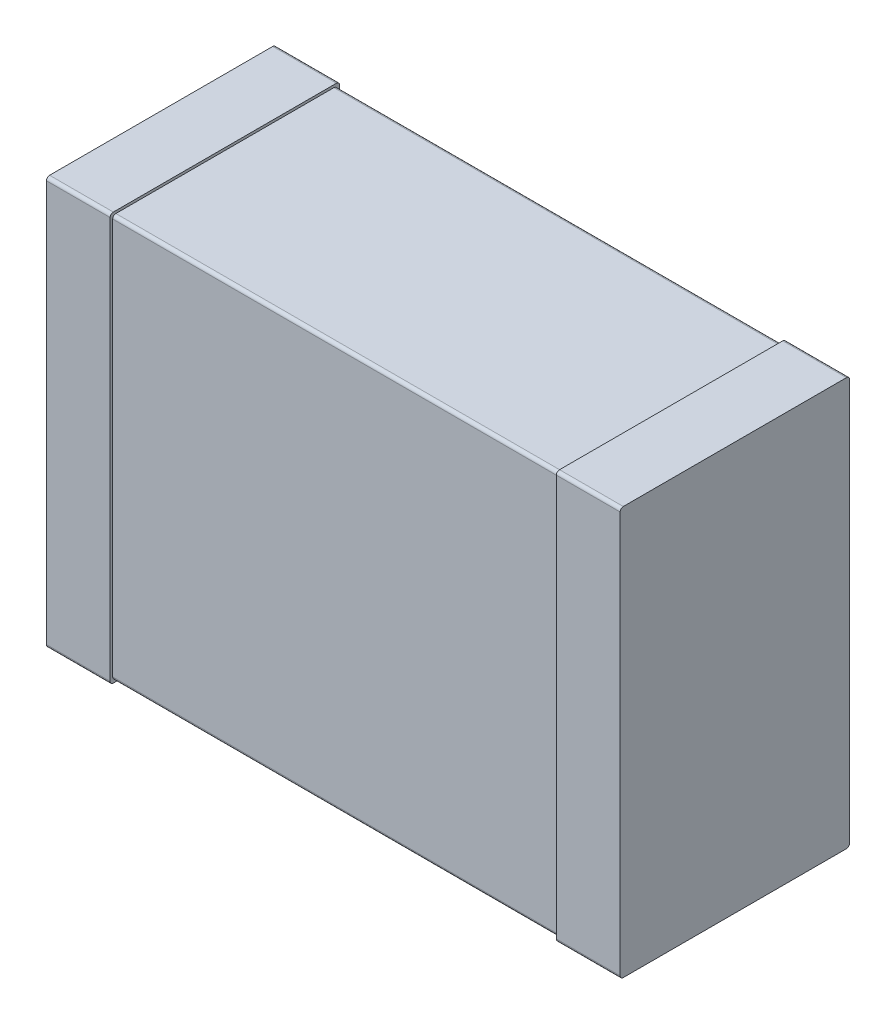
ISO-10303-21;
HEADER;
FILE_DESCRIPTION(('STEP AP214'),'2;1');
FILE_NAME('part.step','',(''),(''),'','','');
FILE_SCHEMA(('AUTOMOTIVE_DESIGN { 1 0 10303 214 1 1 1 1 }'));
ENDSEC;
DATA;
#1=APPLICATION_CONTEXT('core data for automotive mechanical design processes');
#2=APPLICATION_PROTOCOL_DEFINITION('international standard','automotive_design',2000,#1);
#3=PRODUCT_CONTEXT('',#1,'mechanical');
#4=PRODUCT('Part','Part','',(#3));
#5=PRODUCT_RELATED_PRODUCT_CATEGORY('part','',(#4));
#6=PRODUCT_DEFINITION_FORMATION('','',#4);
#7=PRODUCT_DEFINITION_CONTEXT('part definition',#1,'design');
#8=PRODUCT_DEFINITION('design','',#6,#7);
#9=PRODUCT_DEFINITION_SHAPE('','',#8);
#10=(LENGTH_UNIT() NAMED_UNIT(*) SI_UNIT(.MILLI.,.METRE.));
#11=(NAMED_UNIT(*) PLANE_ANGLE_UNIT() SI_UNIT($,.RADIAN.));
#12=(NAMED_UNIT(*) SI_UNIT($,.STERADIAN.) SOLID_ANGLE_UNIT());
#13=UNCERTAINTY_MEASURE_WITH_UNIT(LENGTH_MEASURE(1.E-05),#10,'distance_accuracy_value','');
#14=(GEOMETRIC_REPRESENTATION_CONTEXT(3) GLOBAL_UNCERTAINTY_ASSIGNED_CONTEXT((#13)) GLOBAL_UNIT_ASSIGNED_CONTEXT((#10,
#11,#12)) REPRESENTATION_CONTEXT('',''));
#15=CARTESIAN_POINT('',(0.,0.,0.));
#16=DIRECTION('',(0.,0.,1.));
#17=DIRECTION('',(1.,0.,0.));
#18=AXIS2_PLACEMENT_3D('',#15,#16,#17);
#19=CARTESIAN_POINT('',(-2.25,-1.6,0.));
#20=DIRECTION('',(1.,0.,0.));
#21=DIRECTION('',(0.,0.,-1.));
#22=AXIS2_PLACEMENT_3D('',#19,#20,#21);
#23=PLANE('',#22);
#24=DIRECTION('',(0.,1.,0.));
#25=VECTOR('',#24,1.);
#26=CARTESIAN_POINT('',(-2.25,-1.6,1.8));
#27=LINE('',#26,#25);
#28=CARTESIAN_POINT('',(-2.25,1.575,1.8));
#29=VERTEX_POINT('',#28);
#30=CARTESIAN_POINT('',(-2.25,-1.575,1.8));
#31=VERTEX_POINT('',#30);
#32=EDGE_CURVE('E200',#29,#31,#27,.F.);
#33=ORIENTED_EDGE('',*,*,#32,.F.);
#34=CARTESIAN_POINT('',(-2.25,1.575,1.775));
#35=DIRECTION('',(1.,0.,0.));
#36=DIRECTION('',(0.,0.,-1.));
#37=AXIS2_PLACEMENT_3D('',#34,#35,#36);
#38=CIRCLE('',#37,0.025);
#39=CARTESIAN_POINT('',(-2.25,1.6,1.775));
#40=VERTEX_POINT('',#39);
#41=EDGE_CURVE('E209',#40,#29,#38,.T.);
#42=ORIENTED_EDGE('',*,*,#41,.F.);
#43=DIRECTION('',(0.,0.,1.));
#44=VECTOR('',#43,1.);
#45=CARTESIAN_POINT('',(-2.25,1.6,0.));
#46=LINE('',#45,#44);
#47=CARTESIAN_POINT('',(-2.25,1.6,0.025));
#48=VERTEX_POINT('',#47);
#49=EDGE_CURVE('E213',#48,#40,#46,.T.);
#50=ORIENTED_EDGE('',*,*,#49,.F.);
#51=CARTESIAN_POINT('',(-2.25,1.575,0.025));
#52=DIRECTION('',(1.,0.,0.));
#53=DIRECTION('',(0.,0.,-1.));
#54=AXIS2_PLACEMENT_3D('',#51,#52,#53);
#55=CIRCLE('',#54,0.025);
#56=CARTESIAN_POINT('',(-2.25,1.575,0.));
#57=VERTEX_POINT('',#56);
#58=EDGE_CURVE('E214',#57,#48,#55,.T.);
#59=ORIENTED_EDGE('',*,*,#58,.F.);
#60=DIRECTION('',(0.,1.,0.));
#61=VECTOR('',#60,1.);
#62=CARTESIAN_POINT('',(-2.25,-1.6,0.));
#63=LINE('',#62,#61);
#64=CARTESIAN_POINT('',(-2.25,-1.575,0.));
#65=VERTEX_POINT('',#64);
#66=EDGE_CURVE('E221',#57,#65,#63,.F.);
#67=ORIENTED_EDGE('',*,*,#66,.T.);
#68=CARTESIAN_POINT('',(-2.25,-1.575,0.025));
#69=DIRECTION('',(1.,0.,0.));
#70=DIRECTION('',(0.,0.,-1.));
#71=AXIS2_PLACEMENT_3D('',#68,#69,#70);
#72=CIRCLE('',#71,0.025);
#73=CARTESIAN_POINT('',(-2.25,-1.6,0.025));
#74=VERTEX_POINT('',#73);
#75=EDGE_CURVE('E186',#74,#65,#72,.T.);
#76=ORIENTED_EDGE('',*,*,#75,.F.);
#77=DIRECTION('',(0.,0.,1.));
#78=VECTOR('',#77,1.);
#79=CARTESIAN_POINT('',(-2.25,-1.6,0.));
#80=LINE('',#79,#78);
#81=CARTESIAN_POINT('',(-2.25,-1.6,1.775));
#82=VERTEX_POINT('',#81);
#83=EDGE_CURVE('E184',#74,#82,#80,.T.);
#84=ORIENTED_EDGE('',*,*,#83,.T.);
#85=CARTESIAN_POINT('',(-2.25,-1.575,1.775));
#86=DIRECTION('',(1.,0.,0.));
#87=DIRECTION('',(0.,0.,-1.));
#88=AXIS2_PLACEMENT_3D('',#85,#86,#87);
#89=CIRCLE('',#88,0.025);
#90=EDGE_CURVE('E20',#31,#82,#89,.T.);
#91=ORIENTED_EDGE('',*,*,#90,.F.);
#92=EDGE_LOOP('',(#33,#42,#50,#59,#67,#76,#84,#91));
#93=FACE_BOUND('',#92,.T.);
#94=ADVANCED_FACE('F17',(#93),#23,.F.);
#95=CARTESIAN_POINT('',(2.25,-1.6,0.));
#96=DIRECTION('',(1.,0.,0.));
#97=DIRECTION('',(0.,0.,-1.));
#98=AXIS2_PLACEMENT_3D('',#95,#96,#97);
#99=PLANE('',#98);
#100=DIRECTION('',(0.,1.,0.));
#101=VECTOR('',#100,1.);
#102=CARTESIAN_POINT('',(2.25,-1.6,1.8));
#103=LINE('',#102,#101);
#104=CARTESIAN_POINT('',(2.25,-1.575,1.8));
#105=VERTEX_POINT('',#104);
#106=CARTESIAN_POINT('',(2.25,1.575,1.8));
#107=VERTEX_POINT('',#106);
#108=EDGE_CURVE('E224',#105,#107,#103,.T.);
#109=ORIENTED_EDGE('',*,*,#108,.F.);
#110=CARTESIAN_POINT('',(2.25,-1.575,1.775));
#111=DIRECTION('',(1.,0.,0.));
#112=DIRECTION('',(0.,0.,-1.));
#113=AXIS2_PLACEMENT_3D('',#110,#111,#112);
#114=CIRCLE('',#113,0.025);
#115=CARTESIAN_POINT('',(2.25,-1.6,1.775));
#116=VERTEX_POINT('',#115);
#117=EDGE_CURVE('E182',#105,#116,#114,.T.);
#118=ORIENTED_EDGE('',*,*,#117,.T.);
#119=DIRECTION('',(0.,0.,1.));
#120=VECTOR('',#119,1.);
#121=CARTESIAN_POINT('',(2.25,-1.6,0.));
#122=LINE('',#121,#120);
#123=CARTESIAN_POINT('',(2.25,-1.6,0.025));
#124=VERTEX_POINT('',#123);
#125=EDGE_CURVE('E228',#116,#124,#122,.F.);
#126=ORIENTED_EDGE('',*,*,#125,.T.);
#127=CARTESIAN_POINT('',(2.25,-1.575,0.025));
#128=DIRECTION('',(1.,0.,0.));
#129=DIRECTION('',(0.,0.,-1.));
#130=AXIS2_PLACEMENT_3D('',#127,#128,#129);
#131=CIRCLE('',#130,0.025);
#132=CARTESIAN_POINT('',(2.25,-1.575,0.));
#133=VERTEX_POINT('',#132);
#134=EDGE_CURVE('E231',#133,#124,#131,.F.);
#135=ORIENTED_EDGE('',*,*,#134,.F.);
#136=DIRECTION('',(0.,1.,0.));
#137=VECTOR('',#136,1.);
#138=CARTESIAN_POINT('',(2.25,-1.6,0.));
#139=LINE('',#138,#137);
#140=CARTESIAN_POINT('',(2.25,1.575,0.));
#141=VERTEX_POINT('',#140);
#142=EDGE_CURVE('E236',#133,#141,#139,.T.);
#143=ORIENTED_EDGE('',*,*,#142,.T.);
#144=CARTESIAN_POINT('',(2.25,1.575,0.025));
#145=DIRECTION('',(1.,0.,0.));
#146=DIRECTION('',(0.,0.,-1.));
#147=AXIS2_PLACEMENT_3D('',#144,#145,#146);
#148=CIRCLE('',#147,0.025);
#149=CARTESIAN_POINT('',(2.25,1.6,0.025));
#150=VERTEX_POINT('',#149);
#151=EDGE_CURVE('E239',#150,#141,#148,.F.);
#152=ORIENTED_EDGE('',*,*,#151,.F.);
#153=DIRECTION('',(0.,0.,1.));
#154=VECTOR('',#153,1.);
#155=CARTESIAN_POINT('',(2.25,1.6,0.));
#156=LINE('',#155,#154);
#157=CARTESIAN_POINT('',(2.25,1.6,1.775));
#158=VERTEX_POINT('',#157);
#159=EDGE_CURVE('E232',#158,#150,#156,.F.);
#160=ORIENTED_EDGE('',*,*,#159,.F.);
#161=CARTESIAN_POINT('',(2.25,1.575,1.775));
#162=DIRECTION('',(1.,0.,0.));
#163=DIRECTION('',(0.,0.,-1.));
#164=AXIS2_PLACEMENT_3D('',#161,#162,#163);
#165=CIRCLE('',#164,0.025);
#166=EDGE_CURVE('E286',#107,#158,#165,.F.);
#167=ORIENTED_EDGE('',*,*,#166,.F.);
#168=EDGE_LOOP('',(#109,#118,#126,#135,#143,#152,#160,#167));
#169=FACE_BOUND('',#168,.T.);
#170=ADVANCED_FACE('F303',(#169),#99,.T.);
#171=CARTESIAN_POINT('',(-1.75,-1.555,1.755));
#172=DIRECTION('',(1.,0.,0.));
#173=DIRECTION('',(0.,0.,-1.));
#174=AXIS2_PLACEMENT_3D('',#171,#172,#173);
#175=CYLINDRICAL_SURFACE('',#174,0.025);
#176=DIRECTION('',(1.,0.,0.));
#177=VECTOR('',#176,1.);
#178=CARTESIAN_POINT('',(-1.75,-1.555,1.78));
#179=LINE('',#178,#177);
#180=CARTESIAN_POINT('',(-1.75,-1.555,1.78));
#181=VERTEX_POINT('',#180);
#182=CARTESIAN_POINT('',(1.75,-1.555,1.78));
#183=VERTEX_POINT('',#182);
#184=EDGE_CURVE('E318',#181,#183,#179,.T.);
#185=ORIENTED_EDGE('',*,*,#184,.F.);
#186=CARTESIAN_POINT('',(-1.75,-1.555,1.755));
#187=DIRECTION('',(1.,0.,0.));
#188=DIRECTION('',(0.,0.,-1.));
#189=AXIS2_PLACEMENT_3D('',#186,#187,#188);
#190=CIRCLE('',#189,0.025);
#191=CARTESIAN_POINT('',(-1.75,-1.58,1.755));
#192=VERTEX_POINT('',#191);
#193=EDGE_CURVE('E297',#181,#192,#190,.T.);
#194=ORIENTED_EDGE('',*,*,#193,.T.);
#195=DIRECTION('',(1.,0.,0.));
#196=VECTOR('',#195,1.);
#197=CARTESIAN_POINT('',(-1.75,-1.58,1.755));
#198=LINE('',#197,#196);
#199=CARTESIAN_POINT('',(1.75,-1.58,1.755));
#200=VERTEX_POINT('',#199);
#201=EDGE_CURVE('E203',#192,#200,#198,.T.);
#202=ORIENTED_EDGE('',*,*,#201,.T.);
#203=CARTESIAN_POINT('',(1.75,-1.555,1.755));
#204=DIRECTION('',(1.,0.,0.));
#205=DIRECTION('',(0.,0.,-1.));
#206=AXIS2_PLACEMENT_3D('',#203,#204,#205);
#207=CIRCLE('',#206,0.025);
#208=EDGE_CURVE('E299',#200,#183,#207,.F.);
#209=ORIENTED_EDGE('',*,*,#208,.T.);
#210=EDGE_LOOP('',(#185,#194,#202,#209));
#211=FACE_BOUND('',#210,.T.);
#212=ADVANCED_FACE('F335',(#211),#175,.T.);
#213=CARTESIAN_POINT('',(-1.75,1.555,1.755));
#214=DIRECTION('',(1.,0.,0.));
#215=DIRECTION('',(0.,0.,-1.));
#216=AXIS2_PLACEMENT_3D('',#213,#214,#215);
#217=CYLINDRICAL_SURFACE('',#216,0.025);
#218=CARTESIAN_POINT('',(1.75,1.555,1.755));
#219=DIRECTION('',(1.,0.,0.));
#220=DIRECTION('',(0.,0.,-1.));
#221=AXIS2_PLACEMENT_3D('',#218,#219,#220);
#222=CIRCLE('',#221,0.025);
#223=CARTESIAN_POINT('',(1.75,1.555,1.78));
#224=VERTEX_POINT('',#223);
#225=CARTESIAN_POINT('',(1.75,1.58,1.755));
#226=VERTEX_POINT('',#225);
#227=EDGE_CURVE('E190',#224,#226,#222,.F.);
#228=ORIENTED_EDGE('',*,*,#227,.T.);
#229=DIRECTION('',(1.,0.,0.));
#230=VECTOR('',#229,1.);
#231=CARTESIAN_POINT('',(-1.75,1.58,1.755));
#232=LINE('',#231,#230);
#233=CARTESIAN_POINT('',(-1.75,1.58,1.755));
#234=VERTEX_POINT('',#233);
#235=EDGE_CURVE('E357',#234,#226,#232,.T.);
#236=ORIENTED_EDGE('',*,*,#235,.F.);
#237=CARTESIAN_POINT('',(-1.75,1.555,1.755));
#238=DIRECTION('',(1.,0.,0.));
#239=DIRECTION('',(0.,0.,-1.));
#240=AXIS2_PLACEMENT_3D('',#237,#238,#239);
#241=CIRCLE('',#240,0.025);
#242=CARTESIAN_POINT('',(-1.75,1.555,1.78));
#243=VERTEX_POINT('',#242);
#244=EDGE_CURVE('E295',#234,#243,#241,.T.);
#245=ORIENTED_EDGE('',*,*,#244,.T.);
#246=DIRECTION('',(1.,0.,0.));
#247=VECTOR('',#246,1.);
#248=CARTESIAN_POINT('',(-1.75,1.555,1.78));
#249=LINE('',#248,#247);
#250=EDGE_CURVE('E362',#224,#243,#249,.F.);
#251=ORIENTED_EDGE('',*,*,#250,.F.);
#252=EDGE_LOOP('',(#228,#236,#245,#251));
#253=FACE_BOUND('',#252,.T.);
#254=ADVANCED_FACE('F608',(#253),#217,.T.);
#255=CARTESIAN_POINT('',(-2.25,-1.6,0.));
#256=DIRECTION('',(0.,1.,0.));
#257=DIRECTION('',(0.,0.,1.));
#258=AXIS2_PLACEMENT_3D('',#255,#256,#257);
#259=PLANE('',#258);
#260=ORIENTED_EDGE('',*,*,#83,.F.);
#261=DIRECTION('',(1.,0.,0.));
#262=VECTOR('',#261,1.);
#263=CARTESIAN_POINT('',(-2.25,-1.6,0.025));
#264=LINE('',#263,#262);
#265=CARTESIAN_POINT('',(-1.75,-1.6,0.025));
#266=VERTEX_POINT('',#265);
#267=EDGE_CURVE('E222',#266,#74,#264,.F.);
#268=ORIENTED_EDGE('',*,*,#267,.F.);
#269=DIRECTION('',(0.,0.,-1.));
#270=VECTOR('',#269,1.);
#271=CARTESIAN_POINT('',(-1.75,-1.6,0.));
#272=LINE('',#271,#270);
#273=CARTESIAN_POINT('',(-1.75,-1.6,1.775));
#274=VERTEX_POINT('',#273);
#275=EDGE_CURVE('E194',#274,#266,#272,.T.);
#276=ORIENTED_EDGE('',*,*,#275,.F.);
#277=DIRECTION('',(1.,0.,0.));
#278=VECTOR('',#277,1.);
#279=CARTESIAN_POINT('',(-2.25,-1.6,1.775));
#280=LINE('',#279,#278);
#281=EDGE_CURVE('E178',#82,#274,#280,.T.);
#282=ORIENTED_EDGE('',*,*,#281,.F.);
#283=EDGE_LOOP('',(#260,#268,#276,#282));
#284=FACE_BOUND('',#283,.T.);
#285=ADVANCED_FACE('F193',(#284),#259,.F.);
#286=CARTESIAN_POINT('',(-2.25,-1.575,0.025));
#287=DIRECTION('',(1.,0.,0.));
#288=DIRECTION('',(0.,0.,-1.));
#289=AXIS2_PLACEMENT_3D('',#286,#287,#288);
#290=CYLINDRICAL_SURFACE('',#289,0.025);
#291=CARTESIAN_POINT('',(-1.75,-1.575,0.025));
#292=DIRECTION('',(1.,0.,0.));
#293=DIRECTION('',(0.,0.,-1.));
#294=AXIS2_PLACEMENT_3D('',#291,#292,#293);
#295=CIRCLE('',#294,0.025);
#296=CARTESIAN_POINT('',(-1.75,-1.575,0.));
#297=VERTEX_POINT('',#296);
#298=EDGE_CURVE('E284',#266,#297,#295,.T.);
#299=ORIENTED_EDGE('',*,*,#298,.F.);
#300=ORIENTED_EDGE('',*,*,#267,.T.);
#301=ORIENTED_EDGE('',*,*,#75,.T.);
#302=DIRECTION('',(1.,0.,0.));
#303=VECTOR('',#302,1.);
#304=CARTESIAN_POINT('',(-2.25,-1.575,0.));
#305=LINE('',#304,#303);
#306=EDGE_CURVE('E218',#65,#297,#305,.T.);
#307=ORIENTED_EDGE('',*,*,#306,.T.);
#308=EDGE_LOOP('',(#299,#300,#301,#307));
#309=FACE_BOUND('',#308,.T.);
#310=ADVANCED_FACE('F589',(#309),#290,.T.);
#311=CARTESIAN_POINT('',(-2.25,-1.6,0.));
#312=DIRECTION('',(0.,0.,1.));
#313=DIRECTION('',(1.,0.,0.));
#314=AXIS2_PLACEMENT_3D('',#311,#312,#313);
#315=PLANE('',#314);
#316=DIRECTION('',(0.,1.,0.));
#317=VECTOR('',#316,1.);
#318=CARTESIAN_POINT('',(-1.75,-1.6,0.));
#319=LINE('',#318,#317);
#320=CARTESIAN_POINT('',(-1.75,1.575,0.));
#321=VERTEX_POINT('',#320);
#322=EDGE_CURVE('E283',#297,#321,#319,.T.);
#323=ORIENTED_EDGE('',*,*,#322,.F.);
#324=ORIENTED_EDGE('',*,*,#306,.F.);
#325=ORIENTED_EDGE('',*,*,#66,.F.);
#326=DIRECTION('',(1.,0.,0.));
#327=VECTOR('',#326,1.);
#328=CARTESIAN_POINT('',(-2.25,1.575,0.));
#329=LINE('',#328,#327);
#330=EDGE_CURVE('E215',#321,#57,#329,.F.);
#331=ORIENTED_EDGE('',*,*,#330,.F.);
#332=EDGE_LOOP('',(#323,#324,#325,#331));
#333=FACE_BOUND('',#332,.T.);
#334=ADVANCED_FACE('F579',(#333),#315,.F.);
#335=CARTESIAN_POINT('',(-2.25,1.575,0.025));
#336=DIRECTION('',(1.,0.,0.));
#337=DIRECTION('',(0.,0.,-1.));
#338=AXIS2_PLACEMENT_3D('',#335,#336,#337);
#339=CYLINDRICAL_SURFACE('',#338,0.025);
#340=ORIENTED_EDGE('',*,*,#330,.T.);
#341=ORIENTED_EDGE('',*,*,#58,.T.);
#342=DIRECTION('',(1.,0.,0.));
#343=VECTOR('',#342,1.);
#344=CARTESIAN_POINT('',(-2.25,1.6,0.025));
#345=LINE('',#344,#343);
#346=CARTESIAN_POINT('',(-1.75,1.6,0.025));
#347=VERTEX_POINT('',#346);
#348=EDGE_CURVE('E210',#347,#48,#345,.F.);
#349=ORIENTED_EDGE('',*,*,#348,.F.);
#350=CARTESIAN_POINT('',(-1.75,1.575,0.025));
#351=DIRECTION('',(1.,0.,0.));
#352=DIRECTION('',(0.,0.,-1.));
#353=AXIS2_PLACEMENT_3D('',#350,#351,#352);
#354=CIRCLE('',#353,0.025);
#355=EDGE_CURVE('E281',#321,#347,#354,.T.);
#356=ORIENTED_EDGE('',*,*,#355,.F.);
#357=EDGE_LOOP('',(#340,#341,#349,#356));
#358=FACE_BOUND('',#357,.T.);
#359=ADVANCED_FACE('F569',(#358),#339,.T.);
#360=CARTESIAN_POINT('',(-2.25,1.6,0.));
#361=DIRECTION('',(0.,1.,0.));
#362=DIRECTION('',(0.,0.,1.));
#363=AXIS2_PLACEMENT_3D('',#360,#361,#362);
#364=PLANE('',#363);
#365=ORIENTED_EDGE('',*,*,#49,.T.);
#366=DIRECTION('',(1.,0.,0.));
#367=VECTOR('',#366,1.);
#368=CARTESIAN_POINT('',(-2.25,1.6,1.775));
#369=LINE('',#368,#367);
#370=CARTESIAN_POINT('',(-1.75,1.6,1.775));
#371=VERTEX_POINT('',#370);
#372=EDGE_CURVE('E206',#371,#40,#369,.F.);
#373=ORIENTED_EDGE('',*,*,#372,.F.);
#374=DIRECTION('',(0.,0.,-1.));
#375=VECTOR('',#374,1.);
#376=CARTESIAN_POINT('',(-1.75,1.6,0.));
#377=LINE('',#376,#375);
#378=EDGE_CURVE('E280',#347,#371,#377,.F.);
#379=ORIENTED_EDGE('',*,*,#378,.F.);
#380=ORIENTED_EDGE('',*,*,#348,.T.);
#381=EDGE_LOOP('',(#365,#373,#379,#380));
#382=FACE_BOUND('',#381,.T.);
#383=ADVANCED_FACE('F559',(#382),#364,.T.);
#384=CARTESIAN_POINT('',(-2.25,1.575,1.775));
#385=DIRECTION('',(1.,0.,0.));
#386=DIRECTION('',(0.,0.,-1.));
#387=AXIS2_PLACEMENT_3D('',#384,#385,#386);
#388=CYLINDRICAL_SURFACE('',#387,0.025);
#389=CARTESIAN_POINT('',(-1.75,1.575,1.775));
#390=DIRECTION('',(1.,0.,0.));
#391=DIRECTION('',(0.,0.,-1.));
#392=AXIS2_PLACEMENT_3D('',#389,#390,#391);
#393=CIRCLE('',#392,0.025);
#394=CARTESIAN_POINT('',(-1.75,1.575,1.8));
#395=VERTEX_POINT('',#394);
#396=EDGE_CURVE('E278',#371,#395,#393,.T.);
#397=ORIENTED_EDGE('',*,*,#396,.F.);
#398=ORIENTED_EDGE('',*,*,#372,.T.);
#399=ORIENTED_EDGE('',*,*,#41,.T.);
#400=DIRECTION('',(1.,0.,0.));
#401=VECTOR('',#400,1.);
#402=CARTESIAN_POINT('',(-2.25,1.575,1.8));
#403=LINE('',#402,#401);
#404=EDGE_CURVE('E195',#395,#29,#403,.F.);
#405=ORIENTED_EDGE('',*,*,#404,.F.);
#406=EDGE_LOOP('',(#397,#398,#399,#405));
#407=FACE_BOUND('',#406,.T.);
#408=ADVANCED_FACE('F549',(#407),#388,.T.);
#409=CARTESIAN_POINT('',(-2.25,-1.6,1.8));
#410=DIRECTION('',(0.,0.,1.));
#411=DIRECTION('',(1.,0.,0.));
#412=AXIS2_PLACEMENT_3D('',#409,#410,#411);
#413=PLANE('',#412);
#414=DIRECTION('',(0.,1.,0.));
#415=VECTOR('',#414,1.);
#416=CARTESIAN_POINT('',(-1.75,-1.6,1.8));
#417=LINE('',#416,#415);
#418=CARTESIAN_POINT('',(-1.75,-1.575,1.8));
#419=VERTEX_POINT('',#418);
#420=EDGE_CURVE('E277',#395,#419,#417,.F.);
#421=ORIENTED_EDGE('',*,*,#420,.F.);
#422=ORIENTED_EDGE('',*,*,#404,.T.);
#423=ORIENTED_EDGE('',*,*,#32,.T.);
#424=DIRECTION('',(1.,0.,0.));
#425=VECTOR('',#424,1.);
#426=CARTESIAN_POINT('',(-2.25,-1.575,1.8));
#427=LINE('',#426,#425);
#428=EDGE_CURVE('E181',#419,#31,#427,.F.);
#429=ORIENTED_EDGE('',*,*,#428,.F.);
#430=EDGE_LOOP('',(#421,#422,#423,#429));
#431=FACE_BOUND('',#430,.T.);
#432=ADVANCED_FACE('F540',(#431),#413,.T.);
#433=CARTESIAN_POINT('',(-2.25,-1.575,1.775));
#434=DIRECTION('',(1.,0.,0.));
#435=DIRECTION('',(0.,0.,-1.));
#436=AXIS2_PLACEMENT_3D('',#433,#434,#435);
#437=CYLINDRICAL_SURFACE('',#436,0.025);
#438=ORIENTED_EDGE('',*,*,#428,.T.);
#439=ORIENTED_EDGE('',*,*,#90,.T.);
#440=ORIENTED_EDGE('',*,*,#281,.T.);
#441=CARTESIAN_POINT('',(-1.75,-1.575,1.775));
#442=DIRECTION('',(1.,0.,0.));
#443=DIRECTION('',(0.,0.,-1.));
#444=AXIS2_PLACEMENT_3D('',#441,#442,#443);
#445=CIRCLE('',#444,0.025);
#446=EDGE_CURVE('E274',#419,#274,#445,.T.);
#447=ORIENTED_EDGE('',*,*,#446,.F.);
#448=EDGE_LOOP('',(#438,#439,#440,#447));
#449=FACE_BOUND('',#448,.T.);
#450=ADVANCED_FACE('F175',(#449),#437,.T.);
#451=CARTESIAN_POINT('',(-1.75,-1.58,0.02));
#452=DIRECTION('',(0.,1.,0.));
#453=DIRECTION('',(0.,0.,1.));
#454=AXIS2_PLACEMENT_3D('',#451,#452,#453);
#455=PLANE('',#454);
#456=DIRECTION('',(0.,0.,-1.));
#457=VECTOR('',#456,1.);
#458=CARTESIAN_POINT('',(-1.75,-1.58,0.));
#459=LINE('',#458,#457);
#460=CARTESIAN_POINT('',(-1.75,-1.58,0.045));
#461=VERTEX_POINT('',#460);
#462=EDGE_CURVE('E276',#461,#192,#459,.F.);
#463=ORIENTED_EDGE('',*,*,#462,.F.);
#464=DIRECTION('',(1.,0.,0.));
#465=VECTOR('',#464,1.);
#466=CARTESIAN_POINT('',(-1.75,-1.58,0.045));
#467=LINE('',#466,#465);
#468=CARTESIAN_POINT('',(1.75,-1.58,0.045));
#469=VERTEX_POINT('',#468);
#470=EDGE_CURVE('E272',#469,#461,#467,.F.);
#471=ORIENTED_EDGE('',*,*,#470,.F.);
#472=DIRECTION('',(0.,0.,1.));
#473=VECTOR('',#472,1.);
#474=CARTESIAN_POINT('',(1.75,-1.58,0.02));
#475=LINE('',#474,#473);
#476=EDGE_CURVE('E197',#200,#469,#475,.F.);
#477=ORIENTED_EDGE('',*,*,#476,.F.);
#478=ORIENTED_EDGE('',*,*,#201,.F.);
#479=EDGE_LOOP('',(#463,#471,#477,#478));
#480=FACE_BOUND('',#479,.T.);
#481=ADVANCED_FACE('F339',(#480),#455,.F.);
#482=CARTESIAN_POINT('',(1.75,-1.6,0.));
#483=DIRECTION('',(0.,1.,0.));
#484=DIRECTION('',(0.,0.,1.));
#485=AXIS2_PLACEMENT_3D('',#482,#483,#484);
#486=PLANE('',#485);
#487=DIRECTION('',(0.,0.,-1.));
#488=VECTOR('',#487,1.);
#489=CARTESIAN_POINT('',(1.75,-1.6,0.));
#490=LINE('',#489,#488);
#491=CARTESIAN_POINT('',(1.75,-1.6,1.775));
#492=VERTEX_POINT('',#491);
#493=CARTESIAN_POINT('',(1.75,-1.6,0.025));
#494=VERTEX_POINT('',#493);
#495=EDGE_CURVE('E269',#492,#494,#490,.T.);
#496=ORIENTED_EDGE('',*,*,#495,.T.);
#497=DIRECTION('',(1.,0.,0.));
#498=VECTOR('',#497,1.);
#499=CARTESIAN_POINT('',(1.75,-1.6,0.025));
#500=LINE('',#499,#498);
#501=EDGE_CURVE('E290',#124,#494,#500,.F.);
#502=ORIENTED_EDGE('',*,*,#501,.F.);
#503=ORIENTED_EDGE('',*,*,#125,.F.);
#504=DIRECTION('',(1.,0.,0.));
#505=VECTOR('',#504,1.);
#506=CARTESIAN_POINT('',(1.75,-1.6,1.775));
#507=LINE('',#506,#505);
#508=EDGE_CURVE('E313',#492,#116,#507,.T.);
#509=ORIENTED_EDGE('',*,*,#508,.F.);
#510=EDGE_LOOP('',(#496,#502,#503,#509));
#511=FACE_BOUND('',#510,.T.);
#512=ADVANCED_FACE('F312',(#511),#486,.F.);
#513=CARTESIAN_POINT('',(1.75,-1.575,0.025));
#514=DIRECTION('',(1.,0.,0.));
#515=DIRECTION('',(0.,0.,-1.));
#516=AXIS2_PLACEMENT_3D('',#513,#514,#515);
#517=CYLINDRICAL_SURFACE('',#516,0.025);
#518=ORIENTED_EDGE('',*,*,#134,.T.);
#519=ORIENTED_EDGE('',*,*,#501,.T.);
#520=CARTESIAN_POINT('',(1.75,-1.575,0.025));
#521=DIRECTION('',(1.,0.,0.));
#522=DIRECTION('',(0.,0.,-1.));
#523=AXIS2_PLACEMENT_3D('',#520,#521,#522);
#524=CIRCLE('',#523,0.025);
#525=CARTESIAN_POINT('',(1.75,-1.575,0.));
#526=VERTEX_POINT('',#525);
#527=EDGE_CURVE('E266',#494,#526,#524,.T.);
#528=ORIENTED_EDGE('',*,*,#527,.T.);
#529=DIRECTION('',(1.,0.,0.));
#530=VECTOR('',#529,1.);
#531=CARTESIAN_POINT('',(1.75,-1.575,0.));
#532=LINE('',#531,#530);
#533=EDGE_CURVE('E240',#526,#133,#532,.T.);
#534=ORIENTED_EDGE('',*,*,#533,.T.);
#535=EDGE_LOOP('',(#518,#519,#528,#534));
#536=FACE_BOUND('',#535,.T.);
#537=ADVANCED_FACE('F505',(#536),#517,.T.);
#538=CARTESIAN_POINT('',(1.75,-1.6,0.));
#539=DIRECTION('',(0.,0.,1.));
#540=DIRECTION('',(1.,0.,0.));
#541=AXIS2_PLACEMENT_3D('',#538,#539,#540);
#542=PLANE('',#541);
#543=ORIENTED_EDGE('',*,*,#142,.F.);
#544=ORIENTED_EDGE('',*,*,#533,.F.);
#545=DIRECTION('',(0.,1.,0.));
#546=VECTOR('',#545,1.);
#547=CARTESIAN_POINT('',(1.75,-1.6,0.));
#548=LINE('',#547,#546);
#549=CARTESIAN_POINT('',(1.75,1.575,0.));
#550=VERTEX_POINT('',#549);
#551=EDGE_CURVE('E265',#526,#550,#548,.T.);
#552=ORIENTED_EDGE('',*,*,#551,.T.);
#553=DIRECTION('',(1.,0.,0.));
#554=VECTOR('',#553,1.);
#555=CARTESIAN_POINT('',(1.75,1.575,0.));
#556=LINE('',#555,#554);
#557=EDGE_CURVE('E235',#141,#550,#556,.F.);
#558=ORIENTED_EDGE('',*,*,#557,.F.);
#559=EDGE_LOOP('',(#543,#544,#552,#558));
#560=FACE_BOUND('',#559,.T.);
#561=ADVANCED_FACE('F495',(#560),#542,.F.);
#562=CARTESIAN_POINT('',(1.75,1.575,0.025));
#563=DIRECTION('',(1.,0.,0.));
#564=DIRECTION('',(0.,0.,-1.));
#565=AXIS2_PLACEMENT_3D('',#562,#563,#564);
#566=CYLINDRICAL_SURFACE('',#565,0.025);
#567=ORIENTED_EDGE('',*,*,#557,.T.);
#568=CARTESIAN_POINT('',(1.75,1.575,0.025));
#569=DIRECTION('',(1.,0.,0.));
#570=DIRECTION('',(0.,0.,-1.));
#571=AXIS2_PLACEMENT_3D('',#568,#569,#570);
#572=CIRCLE('',#571,0.025);
#573=CARTESIAN_POINT('',(1.75,1.6,0.025));
#574=VERTEX_POINT('',#573);
#575=EDGE_CURVE('E262',#550,#574,#572,.T.);
#576=ORIENTED_EDGE('',*,*,#575,.T.);
#577=DIRECTION('',(1.,0.,0.));
#578=VECTOR('',#577,1.);
#579=CARTESIAN_POINT('',(1.75,1.6,0.025));
#580=LINE('',#579,#578);
#581=EDGE_CURVE('E234',#150,#574,#580,.F.);
#582=ORIENTED_EDGE('',*,*,#581,.F.);
#583=ORIENTED_EDGE('',*,*,#151,.T.);
#584=EDGE_LOOP('',(#567,#576,#582,#583));
#585=FACE_BOUND('',#584,.T.);
#586=ADVANCED_FACE('F485',(#585),#566,.T.);
#587=CARTESIAN_POINT('',(1.75,1.6,0.));
#588=DIRECTION('',(0.,1.,0.));
#589=DIRECTION('',(0.,0.,1.));
#590=AXIS2_PLACEMENT_3D('',#587,#588,#589);
#591=PLANE('',#590);
#592=DIRECTION('',(0.,0.,-1.));
#593=VECTOR('',#592,1.);
#594=CARTESIAN_POINT('',(1.75,1.6,0.));
#595=LINE('',#594,#593);
#596=CARTESIAN_POINT('',(1.75,1.6,1.775));
#597=VERTEX_POINT('',#596);
#598=EDGE_CURVE('E261',#574,#597,#595,.F.);
#599=ORIENTED_EDGE('',*,*,#598,.T.);
#600=DIRECTION('',(1.,0.,0.));
#601=VECTOR('',#600,1.);
#602=CARTESIAN_POINT('',(1.75,1.6,1.775));
#603=LINE('',#602,#601);
#604=EDGE_CURVE('E227',#158,#597,#603,.F.);
#605=ORIENTED_EDGE('',*,*,#604,.F.);
#606=ORIENTED_EDGE('',*,*,#159,.T.);
#607=ORIENTED_EDGE('',*,*,#581,.T.);
#608=EDGE_LOOP('',(#599,#605,#606,#607));
#609=FACE_BOUND('',#608,.T.);
#610=ADVANCED_FACE('F475',(#609),#591,.T.);
#611=CARTESIAN_POINT('',(1.75,1.575,1.775));
#612=DIRECTION('',(1.,0.,0.));
#613=DIRECTION('',(0.,0.,-1.));
#614=AXIS2_PLACEMENT_3D('',#611,#612,#613);
#615=CYLINDRICAL_SURFACE('',#614,0.025);
#616=ORIENTED_EDGE('',*,*,#166,.T.);
#617=ORIENTED_EDGE('',*,*,#604,.T.);
#618=CARTESIAN_POINT('',(1.75,1.575,1.775));
#619=DIRECTION('',(1.,0.,0.));
#620=DIRECTION('',(0.,0.,-1.));
#621=AXIS2_PLACEMENT_3D('',#618,#619,#620);
#622=CIRCLE('',#621,0.025);
#623=CARTESIAN_POINT('',(1.75,1.575,1.8));
#624=VERTEX_POINT('',#623);
#625=EDGE_CURVE('E258',#597,#624,#622,.T.);
#626=ORIENTED_EDGE('',*,*,#625,.T.);
#627=DIRECTION('',(1.,0.,0.));
#628=VECTOR('',#627,1.);
#629=CARTESIAN_POINT('',(1.75,1.575,1.8));
#630=LINE('',#629,#628);
#631=EDGE_CURVE('E226',#107,#624,#630,.F.);
#632=ORIENTED_EDGE('',*,*,#631,.F.);
#633=EDGE_LOOP('',(#616,#617,#626,#632));
#634=FACE_BOUND('',#633,.T.);
#635=ADVANCED_FACE('F465',(#634),#615,.T.);
#636=CARTESIAN_POINT('',(1.75,-1.6,1.8));
#637=DIRECTION('',(0.,0.,1.));
#638=DIRECTION('',(1.,0.,0.));
#639=AXIS2_PLACEMENT_3D('',#636,#637,#638);
#640=PLANE('',#639);
#641=ORIENTED_EDGE('',*,*,#108,.T.);
#642=ORIENTED_EDGE('',*,*,#631,.T.);
#643=DIRECTION('',(0.,1.,0.));
#644=VECTOR('',#643,1.);
#645=CARTESIAN_POINT('',(1.75,-1.6,1.8));
#646=LINE('',#645,#644);
#647=CARTESIAN_POINT('',(1.75,-1.575,1.8));
#648=VERTEX_POINT('',#647);
#649=EDGE_CURVE('E257',#624,#648,#646,.F.);
#650=ORIENTED_EDGE('',*,*,#649,.T.);
#651=DIRECTION('',(1.,0.,0.));
#652=VECTOR('',#651,1.);
#653=CARTESIAN_POINT('',(1.75,-1.575,1.8));
#654=LINE('',#653,#652);
#655=EDGE_CURVE('E316',#105,#648,#654,.F.);
#656=ORIENTED_EDGE('',*,*,#655,.F.);
#657=EDGE_LOOP('',(#641,#642,#650,#656));
#658=FACE_BOUND('',#657,.T.);
#659=ADVANCED_FACE('F456',(#658),#640,.T.);
#660=CARTESIAN_POINT('',(1.75,-1.575,1.775));
#661=DIRECTION('',(1.,0.,0.));
#662=DIRECTION('',(0.,0.,-1.));
#663=AXIS2_PLACEMENT_3D('',#660,#661,#662);
#664=CYLINDRICAL_SURFACE('',#663,0.025);
#665=ORIENTED_EDGE('',*,*,#655,.T.);
#666=CARTESIAN_POINT('',(1.75,-1.575,1.775));
#667=DIRECTION('',(1.,0.,0.));
#668=DIRECTION('',(0.,0.,-1.));
#669=AXIS2_PLACEMENT_3D('',#666,#667,#668);
#670=CIRCLE('',#669,0.025);
#671=EDGE_CURVE('E254',#648,#492,#670,.T.);
#672=ORIENTED_EDGE('',*,*,#671,.T.);
#673=ORIENTED_EDGE('',*,*,#508,.T.);
#674=ORIENTED_EDGE('',*,*,#117,.F.);
#675=EDGE_LOOP('',(#665,#672,#673,#674));
#676=FACE_BOUND('',#675,.T.);
#677=ADVANCED_FACE('F314',(#676),#664,.T.);
#678=CARTESIAN_POINT('',(-1.75,-1.58,1.78));
#679=DIRECTION('',(0.,0.,1.));
#680=DIRECTION('',(1.,0.,0.));
#681=AXIS2_PLACEMENT_3D('',#678,#679,#680);
#682=PLANE('',#681);
#683=DIRECTION('',(0.,1.,0.));
#684=VECTOR('',#683,1.);
#685=CARTESIAN_POINT('',(1.75,-1.6,1.78));
#686=LINE('',#685,#684);
#687=EDGE_CURVE('E253',#183,#224,#686,.T.);
#688=ORIENTED_EDGE('',*,*,#687,.T.);
#689=ORIENTED_EDGE('',*,*,#250,.T.);
#690=DIRECTION('',(0.,1.,0.));
#691=VECTOR('',#690,1.);
#692=CARTESIAN_POINT('',(-1.75,-1.6,1.78));
#693=LINE('',#692,#691);
#694=EDGE_CURVE('E348',#181,#243,#693,.T.);
#695=ORIENTED_EDGE('',*,*,#694,.F.);
#696=ORIENTED_EDGE('',*,*,#184,.T.);
#697=EDGE_LOOP('',(#688,#689,#695,#696));
#698=FACE_BOUND('',#697,.T.);
#699=ADVANCED_FACE('F438',(#698),#682,.T.);
#700=CARTESIAN_POINT('',(-1.75,1.58,0.02));
#701=DIRECTION('',(0.,1.,0.));
#702=DIRECTION('',(0.,0.,1.));
#703=AXIS2_PLACEMENT_3D('',#700,#701,#702);
#704=PLANE('',#703);
#705=DIRECTION('',(0.,0.,-1.));
#706=VECTOR('',#705,1.);
#707=CARTESIAN_POINT('',(-1.75,1.58,0.));
#708=LINE('',#707,#706);
#709=CARTESIAN_POINT('',(-1.75,1.58,0.045));
#710=VERTEX_POINT('',#709);
#711=EDGE_CURVE('E273',#234,#710,#708,.T.);
#712=ORIENTED_EDGE('',*,*,#711,.F.);
#713=ORIENTED_EDGE('',*,*,#235,.T.);
#714=DIRECTION('',(0.,0.,-1.));
#715=VECTOR('',#714,1.);
#716=CARTESIAN_POINT('',(1.75,1.58,0.));
#717=LINE('',#716,#715);
#718=CARTESIAN_POINT('',(1.75,1.58,0.045));
#719=VERTEX_POINT('',#718);
#720=EDGE_CURVE('E359',#226,#719,#717,.T.);
#721=ORIENTED_EDGE('',*,*,#720,.T.);
#722=DIRECTION('',(1.,0.,0.));
#723=VECTOR('',#722,1.);
#724=CARTESIAN_POINT('',(-1.75,1.58,0.045));
#725=LINE('',#724,#723);
#726=EDGE_CURVE('E249',#710,#719,#725,.T.);
#727=ORIENTED_EDGE('',*,*,#726,.F.);
#728=EDGE_LOOP('',(#712,#713,#721,#727));
#729=FACE_BOUND('',#728,.T.);
#730=ADVANCED_FACE('F382',(#729),#704,.T.);
#731=CARTESIAN_POINT('',(-1.75,-1.6,0.));
#732=DIRECTION('',(1.,0.,0.));
#733=DIRECTION('',(0.,0.,-1.));
#734=AXIS2_PLACEMENT_3D('',#731,#732,#733);
#735=PLANE('',#734);
#736=CARTESIAN_POINT('',(-1.75,1.555,0.045));
#737=DIRECTION('',(1.,0.,0.));
#738=DIRECTION('',(0.,0.,-1.));
#739=AXIS2_PLACEMENT_3D('',#736,#737,#738);
#740=CIRCLE('',#739,0.025);
#741=CARTESIAN_POINT('',(-1.75,1.555,0.02));
#742=VERTEX_POINT('',#741);
#743=EDGE_CURVE('E244',#742,#710,#740,.T.);
#744=ORIENTED_EDGE('',*,*,#743,.F.);
#745=DIRECTION('',(0.,1.,0.));
#746=VECTOR('',#745,1.);
#747=CARTESIAN_POINT('',(-1.75,-1.58,0.02));
#748=LINE('',#747,#746);
#749=CARTESIAN_POINT('',(-1.75,-1.555,0.02));
#750=VERTEX_POINT('',#749);
#751=EDGE_CURVE('E247',#742,#750,#748,.F.);
#752=ORIENTED_EDGE('',*,*,#751,.T.);
#753=CARTESIAN_POINT('',(-1.75,-1.555,0.045));
#754=DIRECTION('',(1.,0.,0.));
#755=DIRECTION('',(0.,0.,-1.));
#756=AXIS2_PLACEMENT_3D('',#753,#754,#755);
#757=CIRCLE('',#756,0.025);
#758=EDGE_CURVE('E270',#461,#750,#757,.T.);
#759=ORIENTED_EDGE('',*,*,#758,.F.);
#760=ORIENTED_EDGE('',*,*,#462,.T.);
#761=ORIENTED_EDGE('',*,*,#193,.F.);
#762=ORIENTED_EDGE('',*,*,#694,.T.);
#763=ORIENTED_EDGE('',*,*,#244,.F.);
#764=ORIENTED_EDGE('',*,*,#711,.T.);
#765=EDGE_LOOP('',(#744,#752,#759,#760,#761,#762,#763,#764));
#766=FACE_BOUND('',#765,.T.);
#767=ORIENTED_EDGE('',*,*,#420,.T.);
#768=ORIENTED_EDGE('',*,*,#446,.T.);
#769=ORIENTED_EDGE('',*,*,#275,.T.);
#770=ORIENTED_EDGE('',*,*,#298,.T.);
#771=ORIENTED_EDGE('',*,*,#322,.T.);
#772=ORIENTED_EDGE('',*,*,#355,.T.);
#773=ORIENTED_EDGE('',*,*,#378,.T.);
#774=ORIENTED_EDGE('',*,*,#396,.T.);
#775=EDGE_LOOP('',(#767,#768,#769,#770,#771,#772,#773,#774));
#776=FACE_BOUND('',#775,.T.);
#777=ADVANCED_FACE('F344',(#766,#776),#735,.T.);
#778=CARTESIAN_POINT('',(-1.75,-1.555,0.045));
#779=DIRECTION('',(1.,0.,0.));
#780=DIRECTION('',(0.,0.,-1.));
#781=AXIS2_PLACEMENT_3D('',#778,#779,#780);
#782=CYLINDRICAL_SURFACE('',#781,0.025);
#783=CARTESIAN_POINT('',(1.75,-1.555,0.045));
#784=DIRECTION('',(1.,0.,0.));
#785=DIRECTION('',(0.,0.,-1.));
#786=AXIS2_PLACEMENT_3D('',#783,#784,#785);
#787=CIRCLE('',#786,0.025);
#788=CARTESIAN_POINT('',(1.75,-1.555,0.02));
#789=VERTEX_POINT('',#788);
#790=EDGE_CURVE('E250',#789,#469,#787,.F.);
#791=ORIENTED_EDGE('',*,*,#790,.T.);
#792=ORIENTED_EDGE('',*,*,#470,.T.);
#793=ORIENTED_EDGE('',*,*,#758,.T.);
#794=DIRECTION('',(1.,0.,0.));
#795=VECTOR('',#794,1.);
#796=CARTESIAN_POINT('',(-1.75,-1.555,0.02));
#797=LINE('',#796,#795);
#798=EDGE_CURVE('E370',#750,#789,#797,.T.);
#799=ORIENTED_EDGE('',*,*,#798,.T.);
#800=EDGE_LOOP('',(#791,#792,#793,#799));
#801=FACE_BOUND('',#800,.T.);
#802=ADVANCED_FACE('F392',(#801),#782,.T.);
#803=CARTESIAN_POINT('',(1.75,-1.6,0.));
#804=DIRECTION('',(1.,0.,0.));
#805=DIRECTION('',(0.,0.,-1.));
#806=AXIS2_PLACEMENT_3D('',#803,#804,#805);
#807=PLANE('',#806);
#808=CARTESIAN_POINT('',(1.75,1.555,0.045));
#809=DIRECTION('',(1.,0.,0.));
#810=DIRECTION('',(0.,0.,-1.));
#811=AXIS2_PLACEMENT_3D('',#808,#809,#810);
#812=CIRCLE('',#811,0.025);
#813=CARTESIAN_POINT('',(1.75,1.555,0.02));
#814=VERTEX_POINT('',#813);
#815=EDGE_CURVE('E34',#719,#814,#812,.F.);
#816=ORIENTED_EDGE('',*,*,#815,.F.);
#817=ORIENTED_EDGE('',*,*,#720,.F.);
#818=ORIENTED_EDGE('',*,*,#227,.F.);
#819=ORIENTED_EDGE('',*,*,#687,.F.);
#820=ORIENTED_EDGE('',*,*,#208,.F.);
#821=ORIENTED_EDGE('',*,*,#476,.T.);
#822=ORIENTED_EDGE('',*,*,#790,.F.);
#823=DIRECTION('',(0.,1.,0.));
#824=VECTOR('',#823,1.);
#825=CARTESIAN_POINT('',(1.75,-1.58,0.02));
#826=LINE('',#825,#824);
#827=EDGE_CURVE('E26',#789,#814,#826,.T.);
#828=ORIENTED_EDGE('',*,*,#827,.T.);
#829=EDGE_LOOP('',(#816,#817,#818,#819,#820,#821,#822,#828));
#830=FACE_BOUND('',#829,.T.);
#831=ORIENTED_EDGE('',*,*,#649,.F.);
#832=ORIENTED_EDGE('',*,*,#625,.F.);
#833=ORIENTED_EDGE('',*,*,#598,.F.);
#834=ORIENTED_EDGE('',*,*,#575,.F.);
#835=ORIENTED_EDGE('',*,*,#551,.F.);
#836=ORIENTED_EDGE('',*,*,#527,.F.);
#837=ORIENTED_EDGE('',*,*,#495,.F.);
#838=ORIENTED_EDGE('',*,*,#671,.F.);
#839=EDGE_LOOP('',(#831,#832,#833,#834,#835,#836,#837,#838));
#840=FACE_BOUND('',#839,.T.);
#841=ADVANCED_FACE('F385',(#830,#840),#807,.F.);
#842=CARTESIAN_POINT('',(-1.75,1.555,0.045));
#843=DIRECTION('',(1.,0.,0.));
#844=DIRECTION('',(0.,0.,-1.));
#845=AXIS2_PLACEMENT_3D('',#842,#843,#844);
#846=CYLINDRICAL_SURFACE('',#845,0.025);
#847=DIRECTION('',(1.,0.,0.));
#848=VECTOR('',#847,1.);
#849=CARTESIAN_POINT('',(-1.75,1.555,0.02));
#850=LINE('',#849,#848);
#851=EDGE_CURVE('E11',#814,#742,#850,.F.);
#852=ORIENTED_EDGE('',*,*,#851,.T.);
#853=ORIENTED_EDGE('',*,*,#743,.T.);
#854=ORIENTED_EDGE('',*,*,#726,.T.);
#855=ORIENTED_EDGE('',*,*,#815,.T.);
#856=EDGE_LOOP('',(#852,#853,#854,#855));
#857=FACE_BOUND('',#856,.T.);
#858=ADVANCED_FACE('F380',(#857),#846,.T.);
#859=CARTESIAN_POINT('',(-1.75,-1.58,0.02));
#860=DIRECTION('',(0.,0.,1.));
#861=DIRECTION('',(1.,0.,0.));
#862=AXIS2_PLACEMENT_3D('',#859,#860,#861);
#863=PLANE('',#862);
#864=ORIENTED_EDGE('',*,*,#827,.F.);
#865=ORIENTED_EDGE('',*,*,#798,.F.);
#866=ORIENTED_EDGE('',*,*,#751,.F.);
#867=ORIENTED_EDGE('',*,*,#851,.F.);
#868=EDGE_LOOP('',(#864,#865,#866,#867));
#869=FACE_BOUND('',#868,.T.);
#870=ADVANCED_FACE('F390',(#869),#863,.F.);
#871=CLOSED_SHELL('',(#94,#170,#212,#254,#285,#310,#334,#359,#383,#408,#432,#450,#481,#512,#537,
#561,#586,#610,#635,#659,#677,#699,#730,#777,#802,#841,#858,#870));
#872=MANIFOLD_SOLID_BREP('B1',#871);
#873=ADVANCED_BREP_SHAPE_REPRESENTATION('',(#18,#872),#14);
#874=SHAPE_DEFINITION_REPRESENTATION(#9,#873);
ENDSEC;
END-ISO-10303-21;
